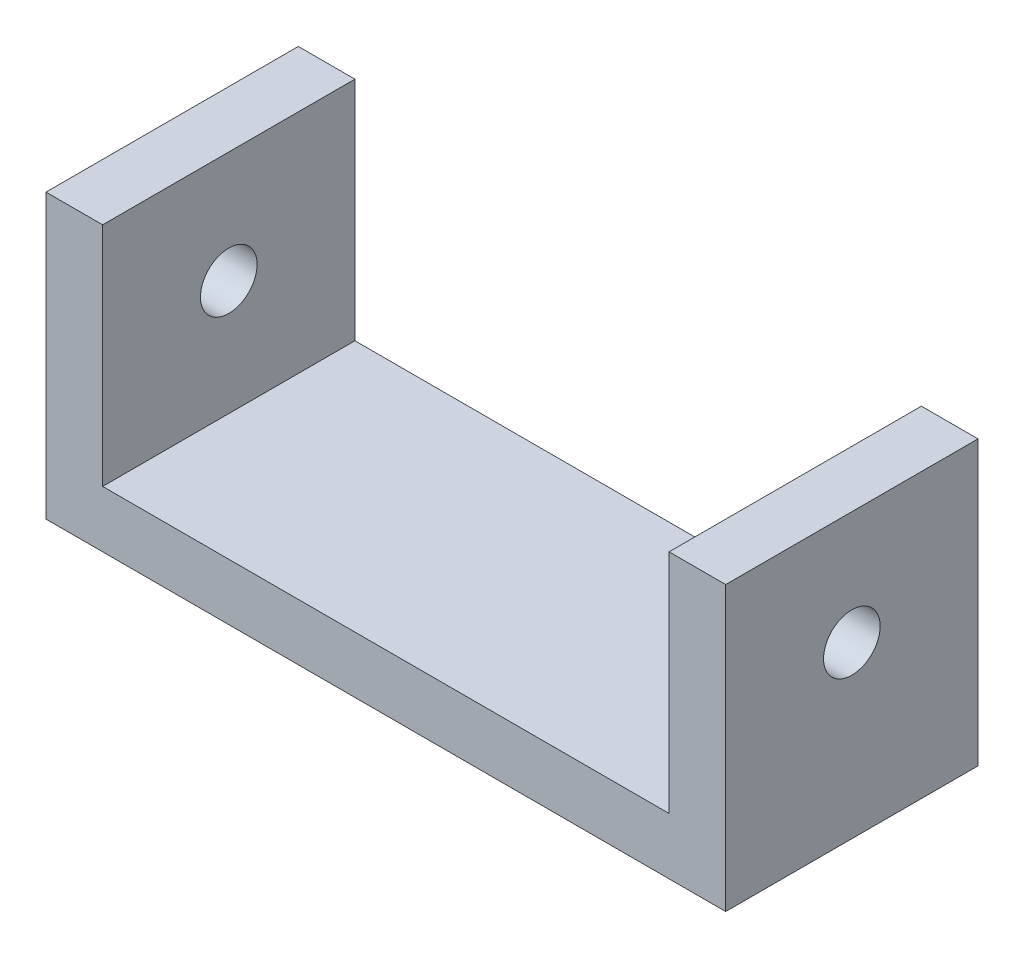
ISO-10303-21;
HEADER;
FILE_DESCRIPTION(('STEP AP214'),'2;1');
FILE_NAME('part.step','',(''),(''),'','','');
FILE_SCHEMA(('AUTOMOTIVE_DESIGN { 1 0 10303 214 1 1 1 1 }'));
ENDSEC;
DATA;
#1=APPLICATION_CONTEXT('core data for automotive mechanical design processes');
#2=APPLICATION_PROTOCOL_DEFINITION('international standard','automotive_design',2000,#1);
#3=PRODUCT_CONTEXT('',#1,'mechanical');
#4=PRODUCT('Part','Part','',(#3));
#5=PRODUCT_RELATED_PRODUCT_CATEGORY('part','',(#4));
#6=PRODUCT_DEFINITION_FORMATION('','',#4);
#7=PRODUCT_DEFINITION_CONTEXT('part definition',#1,'design');
#8=PRODUCT_DEFINITION('design','',#6,#7);
#9=PRODUCT_DEFINITION_SHAPE('','',#8);
#10=(LENGTH_UNIT() NAMED_UNIT(*) SI_UNIT(.MILLI.,.METRE.));
#11=(NAMED_UNIT(*) PLANE_ANGLE_UNIT() SI_UNIT($,.RADIAN.));
#12=(NAMED_UNIT(*) SI_UNIT($,.STERADIAN.) SOLID_ANGLE_UNIT());
#13=UNCERTAINTY_MEASURE_WITH_UNIT(LENGTH_MEASURE(1.E-05),#10,'distance_accuracy_value','');
#14=(GEOMETRIC_REPRESENTATION_CONTEXT(3) GLOBAL_UNCERTAINTY_ASSIGNED_CONTEXT((#13)) GLOBAL_UNIT_ASSIGNED_CONTEXT((#10,
#11,#12)) REPRESENTATION_CONTEXT('',''));
#15=CARTESIAN_POINT('',(0.,0.,0.));
#16=DIRECTION('',(0.,0.,1.));
#17=DIRECTION('',(1.,0.,0.));
#18=AXIS2_PLACEMENT_3D('',#15,#16,#17);
#19=CARTESIAN_POINT('',(0.,6.35,0.));
#20=DIRECTION('',(0.,1.,0.));
#21=DIRECTION('',(0.,0.,1.));
#22=AXIS2_PLACEMENT_3D('',#19,#20,#21);
#23=PLANE('',#22);
#24=DIRECTION('',(1.,0.,0.));
#25=VECTOR('',#24,1.);
#26=CARTESIAN_POINT('',(-38.1,6.35,14.1421245421245));
#27=LINE('',#26,#25);
#28=CARTESIAN_POINT('',(-31.75,6.35,14.1421245421245));
#29=VERTEX_POINT('',#28);
#30=CARTESIAN_POINT('',(31.75,6.35,14.1421245421245));
#31=VERTEX_POINT('',#30);
#32=EDGE_CURVE('E61',#29,#31,#27,.T.);
#33=ORIENTED_EDGE('',*,*,#32,.T.);
#34=DIRECTION('',(0.,0.,1.));
#35=VECTOR('',#34,1.);
#36=CARTESIAN_POINT('',(31.75,6.35,-14.1421245421245));
#37=LINE('',#36,#35);
#38=CARTESIAN_POINT('',(31.75,6.35,-14.1421245421245));
#39=VERTEX_POINT('',#38);
#40=EDGE_CURVE('E56',#39,#31,#37,.T.);
#41=ORIENTED_EDGE('',*,*,#40,.F.);
#42=DIRECTION('',(-1.,0.,0.));
#43=VECTOR('',#42,1.);
#44=CARTESIAN_POINT('',(-38.1,6.35,-14.1421245421245));
#45=LINE('',#44,#43);
#46=CARTESIAN_POINT('',(-31.75,6.35,-14.1421245421245));
#47=VERTEX_POINT('',#46);
#48=EDGE_CURVE('E170',#39,#47,#45,.T.);
#49=ORIENTED_EDGE('',*,*,#48,.T.);
#50=DIRECTION('',(0.,0.,-1.));
#51=VECTOR('',#50,1.);
#52=CARTESIAN_POINT('',(-31.75,6.35,-14.1421245421245));
#53=LINE('',#52,#51);
#54=EDGE_CURVE('E144',#29,#47,#53,.T.);
#55=ORIENTED_EDGE('',*,*,#54,.F.);
#56=EDGE_LOOP('',(#33,#41,#49,#55));
#57=FACE_BOUND('',#56,.T.);
#58=ADVANCED_FACE('F39',(#57),#23,.T.);
#59=CARTESIAN_POINT('',(38.1,6.35,-14.1421245421245));
#60=DIRECTION('',(-1.,0.,0.));
#61=DIRECTION('',(0.,0.,1.));
#62=AXIS2_PLACEMENT_3D('',#59,#60,#61);
#63=PLANE('',#62);
#64=CARTESIAN_POINT('',(38.1,19.05,0.));
#65=DIRECTION('',(1.,0.,0.));
#66=DIRECTION('',(0.,0.,-1.));
#67=AXIS2_PLACEMENT_3D('',#64,#65,#66);
#68=CIRCLE('',#67,3.175);
#69=CARTESIAN_POINT('',(38.1,19.05,-3.175));
#70=VERTEX_POINT('',#69);
#71=EDGE_CURVE('E340',#70,#70,#68,.T.);
#72=ORIENTED_EDGE('',*,*,#71,.F.);
#73=EDGE_LOOP('',(#72));
#74=FACE_BOUND('',#73,.T.);
#75=DIRECTION('',(0.,0.,-1.));
#76=VECTOR('',#75,1.);
#77=CARTESIAN_POINT('',(38.1,0.,-14.1421245421245));
#78=LINE('',#77,#76);
#79=CARTESIAN_POINT('',(38.1,0.,14.1421245421245));
#80=VERTEX_POINT('',#79);
#81=CARTESIAN_POINT('',(38.1,0.,-14.1421245421245));
#82=VERTEX_POINT('',#81);
#83=EDGE_CURVE('E109',#80,#82,#78,.T.);
#84=ORIENTED_EDGE('',*,*,#83,.T.);
#85=DIRECTION('',(0.,-1.,0.));
#86=VECTOR('',#85,1.);
#87=CARTESIAN_POINT('',(38.1,6.35,-14.1421245421245));
#88=LINE('',#87,#86);
#89=CARTESIAN_POINT('',(38.1,31.75,-14.1421245421245));
#90=VERTEX_POINT('',#89);
#91=EDGE_CURVE('E11',#90,#82,#88,.T.);
#92=ORIENTED_EDGE('',*,*,#91,.F.);
#93=DIRECTION('',(0.,0.,-1.));
#94=VECTOR('',#93,1.);
#95=CARTESIAN_POINT('',(38.1,31.75,-14.1421245421245));
#96=LINE('',#95,#94);
#97=CARTESIAN_POINT('',(38.1,31.75,14.1421245421245));
#98=VERTEX_POINT('',#97);
#99=EDGE_CURVE('E107',#98,#90,#96,.T.);
#100=ORIENTED_EDGE('',*,*,#99,.F.);
#101=DIRECTION('',(0.,-1.,0.));
#102=VECTOR('',#101,1.);
#103=CARTESIAN_POINT('',(38.1,6.35,14.1421245421245));
#104=LINE('',#103,#102);
#105=EDGE_CURVE('E176',#98,#80,#104,.T.);
#106=ORIENTED_EDGE('',*,*,#105,.T.);
#107=EDGE_LOOP('',(#84,#92,#100,#106));
#108=FACE_BOUND('',#107,.T.);
#109=ADVANCED_FACE('F41',(#74,#108),#63,.F.);
#110=CARTESIAN_POINT('',(-38.1,6.35,-14.1421245421245));
#111=DIRECTION('',(0.,0.,1.));
#112=DIRECTION('',(1.,0.,0.));
#113=AXIS2_PLACEMENT_3D('',#110,#111,#112);
#114=PLANE('',#113);
#115=DIRECTION('',(-1.,0.,0.));
#116=VECTOR('',#115,1.);
#117=CARTESIAN_POINT('',(-38.1,0.,-14.1421245421245));
#118=LINE('',#117,#116);
#119=CARTESIAN_POINT('',(-38.1,0.,-14.1421245421245));
#120=VERTEX_POINT('',#119);
#121=EDGE_CURVE('E179',#82,#120,#118,.T.);
#122=ORIENTED_EDGE('',*,*,#121,.T.);
#123=DIRECTION('',(0.,-1.,0.));
#124=VECTOR('',#123,1.);
#125=CARTESIAN_POINT('',(-38.1,6.35,-14.1421245421245));
#126=LINE('',#125,#124);
#127=CARTESIAN_POINT('',(-38.1,31.75,-14.1421245421245));
#128=VERTEX_POINT('',#127);
#129=EDGE_CURVE('E49',#128,#120,#126,.T.);
#130=ORIENTED_EDGE('',*,*,#129,.F.);
#131=DIRECTION('',(-1.,0.,0.));
#132=VECTOR('',#131,1.);
#133=CARTESIAN_POINT('',(-38.1,31.75,-14.1421245421245));
#134=LINE('',#133,#132);
#135=CARTESIAN_POINT('',(-31.75,31.75,-14.1421245421245));
#136=VERTEX_POINT('',#135);
#137=EDGE_CURVE('E155',#136,#128,#134,.T.);
#138=ORIENTED_EDGE('',*,*,#137,.F.);
#139=DIRECTION('',(0.,-1.,0.));
#140=VECTOR('',#139,1.);
#141=CARTESIAN_POINT('',(-31.75,31.75,-14.1421245421245));
#142=LINE('',#141,#140);
#143=EDGE_CURVE('E159',#136,#47,#142,.T.);
#144=ORIENTED_EDGE('',*,*,#143,.T.);
#145=ORIENTED_EDGE('',*,*,#48,.F.);
#146=DIRECTION('',(0.,-1.,0.));
#147=VECTOR('',#146,1.);
#148=CARTESIAN_POINT('',(31.75,31.75,-14.1421245421245));
#149=LINE('',#148,#147);
#150=CARTESIAN_POINT('',(31.75,31.75,-14.1421245421245));
#151=VERTEX_POINT('',#150);
#152=EDGE_CURVE('E115',#151,#39,#149,.T.);
#153=ORIENTED_EDGE('',*,*,#152,.F.);
#154=DIRECTION('',(-1.,0.,0.));
#155=VECTOR('',#154,1.);
#156=CARTESIAN_POINT('',(38.1,31.75,-14.1421245421245));
#157=LINE('',#156,#155);
#158=EDGE_CURVE('E112',#90,#151,#157,.T.);
#159=ORIENTED_EDGE('',*,*,#158,.F.);
#160=ORIENTED_EDGE('',*,*,#91,.T.);
#161=EDGE_LOOP('',(#122,#130,#138,#144,#145,#153,#159,#160));
#162=FACE_BOUND('',#161,.T.);
#163=ADVANCED_FACE('F113',(#162),#114,.F.);
#164=CARTESIAN_POINT('',(-38.1,6.35,-14.1421245421245));
#165=DIRECTION('',(1.,0.,0.));
#166=DIRECTION('',(0.,0.,-1.));
#167=AXIS2_PLACEMENT_3D('',#164,#165,#166);
#168=PLANE('',#167);
#169=CARTESIAN_POINT('',(-38.1,19.2479158123226,0.));
#170=DIRECTION('',(-1.,0.,0.));
#171=DIRECTION('',(0.,0.,1.));
#172=AXIS2_PLACEMENT_3D('',#169,#170,#171);
#173=CIRCLE('',#172,3.175);
#174=CARTESIAN_POINT('',(-38.1,19.2479158123226,3.175));
#175=VERTEX_POINT('',#174);
#176=EDGE_CURVE('E131',#175,#175,#173,.T.);
#177=ORIENTED_EDGE('',*,*,#176,.F.);
#178=EDGE_LOOP('',(#177));
#179=FACE_BOUND('',#178,.T.);
#180=DIRECTION('',(0.,0.,1.));
#181=VECTOR('',#180,1.);
#182=CARTESIAN_POINT('',(-38.1,0.,-14.1421245421245));
#183=LINE('',#182,#181);
#184=CARTESIAN_POINT('',(-38.1,0.,14.1421245421245));
#185=VERTEX_POINT('',#184);
#186=EDGE_CURVE('E182',#120,#185,#183,.T.);
#187=ORIENTED_EDGE('',*,*,#186,.T.);
#188=DIRECTION('',(0.,-1.,0.));
#189=VECTOR('',#188,1.);
#190=CARTESIAN_POINT('',(-38.1,6.35,14.1421245421245));
#191=LINE('',#190,#189);
#192=CARTESIAN_POINT('',(-38.1,31.75,14.1421245421245));
#193=VERTEX_POINT('',#192);
#194=EDGE_CURVE('E189',#193,#185,#191,.T.);
#195=ORIENTED_EDGE('',*,*,#194,.F.);
#196=DIRECTION('',(0.,0.,1.));
#197=VECTOR('',#196,1.);
#198=CARTESIAN_POINT('',(-38.1,31.75,-14.1421245421245));
#199=LINE('',#198,#197);
#200=EDGE_CURVE('E145',#128,#193,#199,.T.);
#201=ORIENTED_EDGE('',*,*,#200,.F.);
#202=ORIENTED_EDGE('',*,*,#129,.T.);
#203=EDGE_LOOP('',(#187,#195,#201,#202));
#204=FACE_BOUND('',#203,.T.);
#205=ADVANCED_FACE('F198',(#179,#204),#168,.F.);
#206=CARTESIAN_POINT('',(-38.1,6.35,14.1421245421245));
#207=DIRECTION('',(0.,0.,-1.));
#208=DIRECTION('',(-1.,0.,0.));
#209=AXIS2_PLACEMENT_3D('',#206,#207,#208);
#210=PLANE('',#209);
#211=DIRECTION('',(1.,0.,0.));
#212=VECTOR('',#211,1.);
#213=CARTESIAN_POINT('',(-38.1,0.,14.1421245421245));
#214=LINE('',#213,#212);
#215=EDGE_CURVE('E173',#185,#80,#214,.T.);
#216=ORIENTED_EDGE('',*,*,#215,.T.);
#217=ORIENTED_EDGE('',*,*,#105,.F.);
#218=DIRECTION('',(1.,0.,0.));
#219=VECTOR('',#218,1.);
#220=CARTESIAN_POINT('',(38.1,31.75,14.1421245421245));
#221=LINE('',#220,#219);
#222=CARTESIAN_POINT('',(31.75,31.75,14.1421245421245));
#223=VERTEX_POINT('',#222);
#224=EDGE_CURVE('E124',#223,#98,#221,.T.);
#225=ORIENTED_EDGE('',*,*,#224,.F.);
#226=DIRECTION('',(0.,-1.,0.));
#227=VECTOR('',#226,1.);
#228=CARTESIAN_POINT('',(31.75,31.75,14.1421245421245));
#229=LINE('',#228,#227);
#230=EDGE_CURVE('E137',#223,#31,#229,.T.);
#231=ORIENTED_EDGE('',*,*,#230,.T.);
#232=ORIENTED_EDGE('',*,*,#32,.F.);
#233=DIRECTION('',(0.,-1.,0.));
#234=VECTOR('',#233,1.);
#235=CARTESIAN_POINT('',(-31.75,31.75,14.1421245421245));
#236=LINE('',#235,#234);
#237=CARTESIAN_POINT('',(-31.75,31.75,14.1421245421245));
#238=VERTEX_POINT('',#237);
#239=EDGE_CURVE('E166',#238,#29,#236,.T.);
#240=ORIENTED_EDGE('',*,*,#239,.F.);
#241=DIRECTION('',(1.,0.,0.));
#242=VECTOR('',#241,1.);
#243=CARTESIAN_POINT('',(-38.1,31.75,14.1421245421245));
#244=LINE('',#243,#242);
#245=EDGE_CURVE('E149',#193,#238,#244,.T.);
#246=ORIENTED_EDGE('',*,*,#245,.F.);
#247=ORIENTED_EDGE('',*,*,#194,.T.);
#248=EDGE_LOOP('',(#216,#217,#225,#231,#232,#240,#246,#247));
#249=FACE_BOUND('',#248,.T.);
#250=ADVANCED_FACE('F204',(#249),#210,.F.);
#251=CARTESIAN_POINT('',(0.,0.,0.));
#252=DIRECTION('',(0.,1.,0.));
#253=DIRECTION('',(0.,0.,1.));
#254=AXIS2_PLACEMENT_3D('',#251,#252,#253);
#255=PLANE('',#254);
#256=ORIENTED_EDGE('',*,*,#83,.F.);
#257=ORIENTED_EDGE('',*,*,#215,.F.);
#258=ORIENTED_EDGE('',*,*,#186,.F.);
#259=ORIENTED_EDGE('',*,*,#121,.F.);
#260=EDGE_LOOP('',(#256,#257,#258,#259));
#261=FACE_BOUND('',#260,.T.);
#262=ADVANCED_FACE('F202',(#261),#255,.F.);
#263=CARTESIAN_POINT('',(-31.75,31.75,-14.1421245421245));
#264=DIRECTION('',(-1.,0.,0.));
#265=DIRECTION('',(0.,0.,1.));
#266=AXIS2_PLACEMENT_3D('',#263,#264,#265);
#267=PLANE('',#266);
#268=CARTESIAN_POINT('',(-31.75,19.2479158123226,0.));
#269=DIRECTION('',(-1.,0.,0.));
#270=DIRECTION('',(0.,0.,1.));
#271=AXIS2_PLACEMENT_3D('',#268,#269,#270);
#272=CIRCLE('',#271,3.175);
#273=CARTESIAN_POINT('',(-31.75,19.2479158123226,3.175));
#274=VERTEX_POINT('',#273);
#275=EDGE_CURVE('E128',#274,#274,#272,.T.);
#276=ORIENTED_EDGE('',*,*,#275,.T.);
#277=EDGE_LOOP('',(#276));
#278=FACE_BOUND('',#277,.T.);
#279=ORIENTED_EDGE('',*,*,#54,.T.);
#280=ORIENTED_EDGE('',*,*,#143,.F.);
#281=DIRECTION('',(0.,0.,-1.));
#282=VECTOR('',#281,1.);
#283=CARTESIAN_POINT('',(-31.75,31.75,-14.1421245421245));
#284=LINE('',#283,#282);
#285=EDGE_CURVE('E152',#238,#136,#284,.T.);
#286=ORIENTED_EDGE('',*,*,#285,.F.);
#287=ORIENTED_EDGE('',*,*,#239,.T.);
#288=EDGE_LOOP('',(#279,#280,#286,#287));
#289=FACE_BOUND('',#288,.T.);
#290=ADVANCED_FACE('F212',(#278,#289),#267,.F.);
#291=CARTESIAN_POINT('',(0.,31.75,0.));
#292=DIRECTION('',(0.,1.,0.));
#293=DIRECTION('',(0.,0.,1.));
#294=AXIS2_PLACEMENT_3D('',#291,#292,#293);
#295=PLANE('',#294);
#296=ORIENTED_EDGE('',*,*,#200,.T.);
#297=ORIENTED_EDGE('',*,*,#245,.T.);
#298=ORIENTED_EDGE('',*,*,#285,.T.);
#299=ORIENTED_EDGE('',*,*,#137,.T.);
#300=EDGE_LOOP('',(#296,#297,#298,#299));
#301=FACE_BOUND('',#300,.T.);
#302=ADVANCED_FACE('F209',(#301),#295,.T.);
#303=CARTESIAN_POINT('',(31.75,31.75,-14.1421245421245));
#304=DIRECTION('',(1.,0.,0.));
#305=DIRECTION('',(0.,0.,-1.));
#306=AXIS2_PLACEMENT_3D('',#303,#304,#305);
#307=PLANE('',#306);
#308=CARTESIAN_POINT('',(31.75,19.05,0.));
#309=DIRECTION('',(1.,0.,0.));
#310=DIRECTION('',(0.,0.,-1.));
#311=AXIS2_PLACEMENT_3D('',#308,#309,#310);
#312=CIRCLE('',#311,3.175);
#313=CARTESIAN_POINT('',(31.75,19.05,-3.175));
#314=VERTEX_POINT('',#313);
#315=EDGE_CURVE('E43',#314,#314,#312,.T.);
#316=ORIENTED_EDGE('',*,*,#315,.T.);
#317=EDGE_LOOP('',(#316));
#318=FACE_BOUND('',#317,.T.);
#319=ORIENTED_EDGE('',*,*,#40,.T.);
#320=ORIENTED_EDGE('',*,*,#230,.F.);
#321=DIRECTION('',(0.,0.,1.));
#322=VECTOR('',#321,1.);
#323=CARTESIAN_POINT('',(31.75,31.75,-14.1421245421245));
#324=LINE('',#323,#322);
#325=EDGE_CURVE('E119',#151,#223,#324,.T.);
#326=ORIENTED_EDGE('',*,*,#325,.F.);
#327=ORIENTED_EDGE('',*,*,#152,.T.);
#328=EDGE_LOOP('',(#319,#320,#326,#327));
#329=FACE_BOUND('',#328,.T.);
#330=ADVANCED_FACE('F215',(#318,#329),#307,.F.);
#331=CARTESIAN_POINT('',(0.,31.75,0.));
#332=DIRECTION('',(0.,-1.,0.));
#333=DIRECTION('',(0.,0.,-1.));
#334=AXIS2_PLACEMENT_3D('',#331,#332,#333);
#335=PLANE('',#334);
#336=ORIENTED_EDGE('',*,*,#99,.T.);
#337=ORIENTED_EDGE('',*,*,#158,.T.);
#338=ORIENTED_EDGE('',*,*,#325,.T.);
#339=ORIENTED_EDGE('',*,*,#224,.T.);
#340=EDGE_LOOP('',(#336,#337,#338,#339));
#341=FACE_BOUND('',#340,.T.);
#342=ADVANCED_FACE('F122',(#341),#335,.F.);
#343=CARTESIAN_POINT('',(-31.75,19.2479158123226,0.));
#344=DIRECTION('',(-1.,0.,0.));
#345=DIRECTION('',(0.,0.,1.));
#346=AXIS2_PLACEMENT_3D('',#343,#344,#345);
#347=CYLINDRICAL_SURFACE('',#346,3.175);
#348=ORIENTED_EDGE('',*,*,#275,.F.);
#349=EDGE_LOOP('',(#348));
#350=FACE_BOUND('',#349,.T.);
#351=ORIENTED_EDGE('',*,*,#176,.T.);
#352=EDGE_LOOP('',(#351));
#353=FACE_BOUND('',#352,.T.);
#354=ADVANCED_FACE('F223',(#350,#353),#347,.F.);
#355=CARTESIAN_POINT('',(30.48,19.05,0.));
#356=DIRECTION('',(1.,0.,0.));
#357=DIRECTION('',(0.,0.,-1.));
#358=AXIS2_PLACEMENT_3D('',#355,#356,#357);
#359=CYLINDRICAL_SURFACE('',#358,3.175);
#360=ORIENTED_EDGE('',*,*,#71,.T.);
#361=EDGE_LOOP('',(#360));
#362=FACE_BOUND('',#361,.T.);
#363=ORIENTED_EDGE('',*,*,#315,.F.);
#364=EDGE_LOOP('',(#363));
#365=FACE_BOUND('',#364,.T.);
#366=ADVANCED_FACE('F284',(#362,#365),#359,.F.);
#367=CLOSED_SHELL('',(#58,#109,#163,#205,#250,#262,#290,#302,#330,#342,#354,#366));
#368=MANIFOLD_SOLID_BREP('B2',#367);
#369=ADVANCED_BREP_SHAPE_REPRESENTATION('',(#18,#368),#14);
#370=SHAPE_DEFINITION_REPRESENTATION(#9,#369);
ENDSEC;
END-ISO-10303-21;
